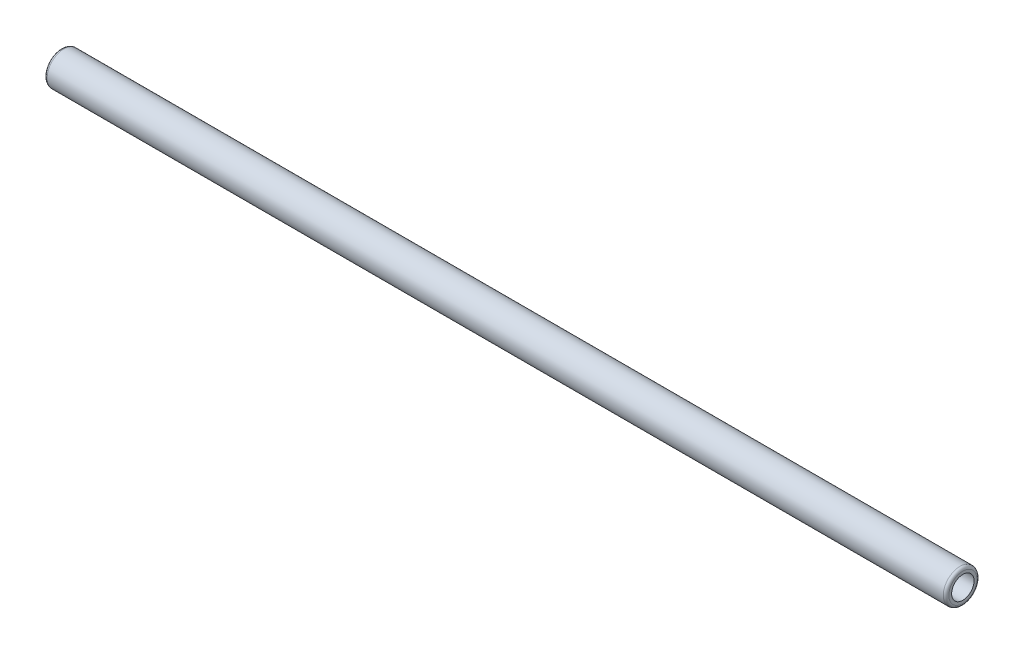
ISO-10303-21;
HEADER;
FILE_DESCRIPTION(('STEP AP214'),'2;1');
FILE_NAME('part.step','',(''),(''),'','','');
FILE_SCHEMA(('AUTOMOTIVE_DESIGN { 1 0 10303 214 1 1 1 1 }'));
ENDSEC;
DATA;
#1=APPLICATION_CONTEXT('core data for automotive mechanical design processes');
#2=APPLICATION_PROTOCOL_DEFINITION('international standard','automotive_design',2000,#1);
#3=PRODUCT_CONTEXT('',#1,'mechanical');
#4=PRODUCT('Part','Part','',(#3));
#5=PRODUCT_RELATED_PRODUCT_CATEGORY('part','',(#4));
#6=PRODUCT_DEFINITION_FORMATION('','',#4);
#7=PRODUCT_DEFINITION_CONTEXT('part definition',#1,'design');
#8=PRODUCT_DEFINITION('design','',#6,#7);
#9=PRODUCT_DEFINITION_SHAPE('','',#8);
#10=(LENGTH_UNIT() NAMED_UNIT(*) SI_UNIT(.MILLI.,.METRE.));
#11=(NAMED_UNIT(*) PLANE_ANGLE_UNIT() SI_UNIT($,.RADIAN.));
#12=(NAMED_UNIT(*) SI_UNIT($,.STERADIAN.) SOLID_ANGLE_UNIT());
#13=UNCERTAINTY_MEASURE_WITH_UNIT(LENGTH_MEASURE(1.E-05),#10,'distance_accuracy_value','');
#14=(GEOMETRIC_REPRESENTATION_CONTEXT(3) GLOBAL_UNCERTAINTY_ASSIGNED_CONTEXT((#13)) GLOBAL_UNIT_ASSIGNED_CONTEXT((#10,
#11,#12)) REPRESENTATION_CONTEXT('',''));
#15=CARTESIAN_POINT('',(0.,0.,0.));
#16=DIRECTION('',(0.,0.,1.));
#17=DIRECTION('',(1.,0.,0.));
#18=AXIS2_PLACEMENT_3D('',#15,#16,#17);
#19=CARTESIAN_POINT('',(161.,0.,0.));
#20=DIRECTION('',(1.,0.,0.));
#21=DIRECTION('',(0.,0.,-1.));
#22=AXIS2_PLACEMENT_3D('',#19,#20,#21);
#23=PLANE('',#22);
#24=CARTESIAN_POINT('',(161.,0.,0.));
#25=DIRECTION('',(1.,0.,0.));
#26=DIRECTION('',(0.,0.,-1.));
#27=AXIS2_PLACEMENT_3D('',#24,#25,#26);
#28=CIRCLE('',#27,2.5);
#29=CARTESIAN_POINT('',(161.,0.,-2.5));
#30=VERTEX_POINT('',#29);
#31=EDGE_CURVE('E10',#30,#30,#28,.T.);
#32=ORIENTED_EDGE('',*,*,#31,.T.);
#33=EDGE_LOOP('',(#32));
#34=FACE_BOUND('',#33,.T.);
#35=CARTESIAN_POINT('',(161.,0.,0.));
#36=DIRECTION('',(1.,0.,0.));
#37=DIRECTION('',(0.,0.,-1.));
#38=AXIS2_PLACEMENT_3D('',#35,#36,#37);
#39=CIRCLE('',#38,2.);
#40=CARTESIAN_POINT('',(161.,0.,-2.));
#41=VERTEX_POINT('',#40);
#42=EDGE_CURVE('E52',#41,#41,#39,.T.);
#43=ORIENTED_EDGE('',*,*,#42,.F.);
#44=EDGE_LOOP('',(#43));
#45=FACE_BOUND('',#44,.T.);
#46=ADVANCED_FACE('F32',(#34,#45),#23,.T.);
#47=CARTESIAN_POINT('',(0.,0.,0.));
#48=DIRECTION('',(1.,0.,0.));
#49=DIRECTION('',(0.,0.,-1.));
#50=AXIS2_PLACEMENT_3D('',#47,#48,#49);
#51=PLANE('',#50);
#52=CARTESIAN_POINT('',(0.,0.,0.));
#53=DIRECTION('',(1.,0.,0.));
#54=DIRECTION('',(0.,0.,-1.));
#55=AXIS2_PLACEMENT_3D('',#52,#53,#54);
#56=CIRCLE('',#55,2.5);
#57=CARTESIAN_POINT('',(0.,0.,-2.5));
#58=VERTEX_POINT('',#57);
#59=EDGE_CURVE('E39',#58,#58,#56,.F.);
#60=ORIENTED_EDGE('',*,*,#59,.T.);
#61=EDGE_LOOP('',(#60));
#62=FACE_BOUND('',#61,.T.);
#63=CARTESIAN_POINT('',(0.,0.,0.));
#64=DIRECTION('',(1.,0.,0.));
#65=DIRECTION('',(0.,0.,-1.));
#66=AXIS2_PLACEMENT_3D('',#63,#64,#65);
#67=CIRCLE('',#66,2.);
#68=CARTESIAN_POINT('',(0.,0.,-2.));
#69=VERTEX_POINT('',#68);
#70=EDGE_CURVE('E53',#69,#69,#67,.T.);
#71=ORIENTED_EDGE('',*,*,#70,.T.);
#72=EDGE_LOOP('',(#71));
#73=FACE_BOUND('',#72,.T.);
#74=ADVANCED_FACE('F63',(#62,#73),#51,.F.);
#75=CARTESIAN_POINT('',(161.,0.,0.));
#76=DIRECTION('',(-1.,0.,0.));
#77=DIRECTION('',(0.,0.,1.));
#78=AXIS2_PLACEMENT_3D('',#75,#76,#77);
#79=CYLINDRICAL_SURFACE('',#78,3.);
#80=CARTESIAN_POINT('',(0.5,0.,0.));
#81=DIRECTION('',(1.,0.,0.));
#82=DIRECTION('',(0.,0.,-1.));
#83=AXIS2_PLACEMENT_3D('',#80,#81,#82);
#84=CIRCLE('',#83,3.);
#85=CARTESIAN_POINT('',(0.5,0.,-3.));
#86=VERTEX_POINT('',#85);
#87=EDGE_CURVE('E43',#86,#86,#84,.T.);
#88=ORIENTED_EDGE('',*,*,#87,.T.);
#89=EDGE_LOOP('',(#88));
#90=FACE_BOUND('',#89,.T.);
#91=CARTESIAN_POINT('',(160.5,0.,0.));
#92=DIRECTION('',(1.,0.,0.));
#93=DIRECTION('',(0.,0.,-1.));
#94=AXIS2_PLACEMENT_3D('',#91,#92,#93);
#95=CIRCLE('',#94,3.);
#96=CARTESIAN_POINT('',(160.5,0.,-3.));
#97=VERTEX_POINT('',#96);
#98=EDGE_CURVE('E47',#97,#97,#95,.F.);
#99=ORIENTED_EDGE('',*,*,#98,.T.);
#100=EDGE_LOOP('',(#99));
#101=FACE_BOUND('',#100,.T.);
#102=ADVANCED_FACE('F68',(#90,#101),#79,.T.);
#103=CARTESIAN_POINT('',(161.,0.,0.));
#104=DIRECTION('',(-1.,0.,0.));
#105=DIRECTION('',(0.,0.,1.));
#106=AXIS2_PLACEMENT_3D('',#103,#104,#105);
#107=CYLINDRICAL_SURFACE('',#106,2.);
#108=ORIENTED_EDGE('',*,*,#42,.T.);
#109=EDGE_LOOP('',(#108));
#110=FACE_BOUND('',#109,.T.);
#111=ORIENTED_EDGE('',*,*,#70,.F.);
#112=EDGE_LOOP('',(#111));
#113=FACE_BOUND('',#112,.T.);
#114=ADVANCED_FACE('F59',(#110,#113),#107,.F.);
#115=CARTESIAN_POINT('',(0.5,0.,0.));
#116=DIRECTION('',(1.,0.,0.));
#117=DIRECTION('',(0.,0.,-1.));
#118=AXIS2_PLACEMENT_3D('',#115,#116,#117);
#119=TOROIDAL_SURFACE('',#118,2.5,0.5);
#120=ORIENTED_EDGE('',*,*,#59,.F.);
#121=EDGE_LOOP('',(#120));
#122=FACE_BOUND('',#121,.T.);
#123=ORIENTED_EDGE('',*,*,#87,.F.);
#124=EDGE_LOOP('',(#123));
#125=FACE_BOUND('',#124,.T.);
#126=ADVANCED_FACE('F74',(#122,#125),#119,.T.);
#127=CARTESIAN_POINT('',(160.5,0.,0.));
#128=DIRECTION('',(1.,0.,0.));
#129=DIRECTION('',(0.,0.,-1.));
#130=AXIS2_PLACEMENT_3D('',#127,#128,#129);
#131=TOROIDAL_SURFACE('',#130,2.5,0.5);
#132=ORIENTED_EDGE('',*,*,#98,.F.);
#133=EDGE_LOOP('',(#132));
#134=FACE_BOUND('',#133,.T.);
#135=ORIENTED_EDGE('',*,*,#31,.F.);
#136=EDGE_LOOP('',(#135));
#137=FACE_BOUND('',#136,.T.);
#138=ADVANCED_FACE('F34',(#134,#137),#131,.T.);
#139=CLOSED_SHELL('',(#46,#74,#102,#114,#126,#138));
#140=MANIFOLD_SOLID_BREP('B2',#139);
#141=ADVANCED_BREP_SHAPE_REPRESENTATION('',(#18,#140),#14);
#142=SHAPE_DEFINITION_REPRESENTATION(#9,#141);
ENDSEC;
END-ISO-10303-21;
